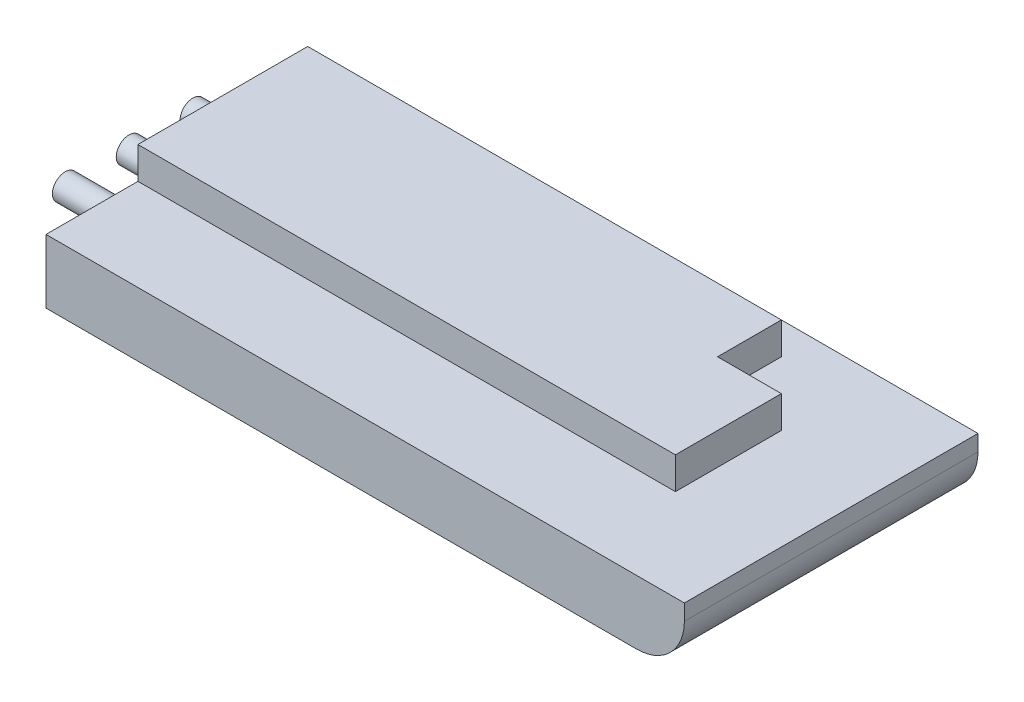
ISO-10303-21;
HEADER;
FILE_DESCRIPTION(('STEP AP214'),'2;1');
FILE_NAME('part.step','',(''),(''),'','','');
FILE_SCHEMA(('AUTOMOTIVE_DESIGN { 1 0 10303 214 1 1 1 1 }'));
ENDSEC;
DATA;
#1=APPLICATION_CONTEXT('core data for automotive mechanical design processes');
#2=APPLICATION_PROTOCOL_DEFINITION('international standard','automotive_design',2000,#1);
#3=PRODUCT_CONTEXT('',#1,'mechanical');
#4=PRODUCT('Part','Part','',(#3));
#5=PRODUCT_RELATED_PRODUCT_CATEGORY('part','',(#4));
#6=PRODUCT_DEFINITION_FORMATION('','',#4);
#7=PRODUCT_DEFINITION_CONTEXT('part definition',#1,'design');
#8=PRODUCT_DEFINITION('design','',#6,#7);
#9=PRODUCT_DEFINITION_SHAPE('','',#8);
#10=(LENGTH_UNIT() NAMED_UNIT(*) SI_UNIT(.MILLI.,.METRE.));
#11=(NAMED_UNIT(*) PLANE_ANGLE_UNIT() SI_UNIT($,.RADIAN.));
#12=(NAMED_UNIT(*) SI_UNIT($,.STERADIAN.) SOLID_ANGLE_UNIT());
#13=UNCERTAINTY_MEASURE_WITH_UNIT(LENGTH_MEASURE(1.E-05),#10,'distance_accuracy_value','');
#14=(GEOMETRIC_REPRESENTATION_CONTEXT(3) GLOBAL_UNCERTAINTY_ASSIGNED_CONTEXT((#13)) GLOBAL_UNIT_ASSIGNED_CONTEXT((#10,
#11,#12)) REPRESENTATION_CONTEXT('',''));
#15=CARTESIAN_POINT('',(0.,0.,0.));
#16=DIRECTION('',(0.,0.,1.));
#17=DIRECTION('',(1.,0.,0.));
#18=AXIS2_PLACEMENT_3D('',#15,#16,#17);
#19=CARTESIAN_POINT('',(0.,12.7,0.));
#20=DIRECTION('',(0.,1.,0.));
#21=DIRECTION('',(0.,0.,1.));
#22=AXIS2_PLACEMENT_3D('',#19,#20,#21);
#23=PLANE('',#22);
#24=DIRECTION('',(0.,0.,-1.));
#25=VECTOR('',#24,1.);
#26=CARTESIAN_POINT('',(221.234,12.7,0.));
#27=LINE('',#26,#25);
#28=CARTESIAN_POINT('',(221.234,12.7,-39.37));
#29=VERTEX_POINT('',#28);
#30=CARTESIAN_POINT('',(221.234,12.7,-52.07));
#31=VERTEX_POINT('',#30);
#32=EDGE_CURVE('E190',#29,#31,#27,.T.);
#33=ORIENTED_EDGE('',*,*,#32,.F.);
#34=DIRECTION('',(-1.,0.,0.));
#35=VECTOR('',#34,1.);
#36=CARTESIAN_POINT('',(233.934,12.7,-39.37));
#37=LINE('',#36,#35);
#38=CARTESIAN_POINT('',(233.934,12.7,-39.37));
#39=VERTEX_POINT('',#38);
#40=EDGE_CURVE('E146',#39,#29,#37,.T.);
#41=ORIENTED_EDGE('',*,*,#40,.F.);
#42=DIRECTION('',(0.,0.,-1.));
#43=VECTOR('',#42,1.);
#44=CARTESIAN_POINT('',(233.934,12.7,-18.288));
#45=LINE('',#44,#43);
#46=CARTESIAN_POINT('',(233.934,12.7,-18.288));
#47=VERTEX_POINT('',#46);
#48=EDGE_CURVE('E139',#47,#39,#45,.T.);
#49=ORIENTED_EDGE('',*,*,#48,.F.);
#50=DIRECTION('',(-1.,0.,0.));
#51=VECTOR('',#50,1.);
#52=CARTESIAN_POINT('',(0.,12.7,-18.288));
#53=LINE('',#52,#51);
#54=CARTESIAN_POINT('',(127.,12.7,-18.288));
#55=VERTEX_POINT('',#54);
#56=EDGE_CURVE('E123',#47,#55,#53,.T.);
#57=ORIENTED_EDGE('',*,*,#56,.T.);
#58=DIRECTION('',(0.,0.,1.));
#59=VECTOR('',#58,1.);
#60=CARTESIAN_POINT('',(127.,12.7,0.));
#61=LINE('',#60,#59);
#62=CARTESIAN_POINT('',(127.,12.7,0.));
#63=VERTEX_POINT('',#62);
#64=EDGE_CURVE('E182',#55,#63,#61,.T.);
#65=ORIENTED_EDGE('',*,*,#64,.T.);
#66=DIRECTION('',(1.,0.,0.));
#67=VECTOR('',#66,1.);
#68=CARTESIAN_POINT('',(0.,12.7,0.));
#69=LINE('',#68,#67);
#70=CARTESIAN_POINT('',(254.,12.7,0.));
#71=VERTEX_POINT('',#70);
#72=EDGE_CURVE('E192',#63,#71,#69,.T.);
#73=ORIENTED_EDGE('',*,*,#72,.T.);
#74=DIRECTION('',(0.,0.,-1.));
#75=VECTOR('',#74,1.);
#76=CARTESIAN_POINT('',(254.,12.7,0.));
#77=LINE('',#76,#75);
#78=CARTESIAN_POINT('',(254.,12.7,-58.42));
#79=VERTEX_POINT('',#78);
#80=EDGE_CURVE('E194',#71,#79,#77,.T.);
#81=ORIENTED_EDGE('',*,*,#80,.T.);
#82=DIRECTION('',(-1.,0.,0.));
#83=VECTOR('',#82,1.);
#84=CARTESIAN_POINT('',(0.,12.7,-58.42));
#85=LINE('',#84,#83);
#86=CARTESIAN_POINT('',(127.,12.7,-58.42));
#87=VERTEX_POINT('',#86);
#88=EDGE_CURVE('E196',#79,#87,#85,.T.);
#89=ORIENTED_EDGE('',*,*,#88,.T.);
#90=CARTESIAN_POINT('',(127.,12.7,-52.07));
#91=VERTEX_POINT('',#90);
#92=EDGE_CURVE('E184',#87,#91,#61,.T.);
#93=ORIENTED_EDGE('',*,*,#92,.T.);
#94=DIRECTION('',(-1.,0.,0.));
#95=VECTOR('',#94,1.);
#96=CARTESIAN_POINT('',(0.,12.7,-52.07));
#97=LINE('',#96,#95);
#98=EDGE_CURVE('E132',#31,#91,#97,.T.);
#99=ORIENTED_EDGE('',*,*,#98,.F.);
#100=EDGE_LOOP('',(#33,#41,#49,#57,#65,#73,#81,#89,#93,#99));
#101=FACE_BOUND('',#100,.T.);
#102=ADVANCED_FACE('F40',(#101),#23,.T.);
#103=CARTESIAN_POINT('',(221.234,12.7,0.));
#104=DIRECTION('',(1.,0.,0.));
#105=DIRECTION('',(0.,0.,-1.));
#106=AXIS2_PLACEMENT_3D('',#103,#104,#105);
#107=PLANE('',#106);
#108=DIRECTION('',(0.,0.,-1.));
#109=VECTOR('',#108,1.);
#110=CARTESIAN_POINT('',(221.234,19.05,0.));
#111=LINE('',#110,#109);
#112=CARTESIAN_POINT('',(221.234,19.05,-39.37));
#113=VERTEX_POINT('',#112);
#114=CARTESIAN_POINT('',(221.234,19.05,-52.07));
#115=VERTEX_POINT('',#114);
#116=EDGE_CURVE('E133',#113,#115,#111,.T.);
#117=ORIENTED_EDGE('',*,*,#116,.F.);
#118=DIRECTION('',(0.,-1.,0.));
#119=VECTOR('',#118,1.);
#120=CARTESIAN_POINT('',(221.234,43.6618005030107,-39.37));
#121=LINE('',#120,#119);
#122=EDGE_CURVE('E55',#113,#29,#121,.T.);
#123=ORIENTED_EDGE('',*,*,#122,.T.);
#124=ORIENTED_EDGE('',*,*,#32,.T.);
#125=DIRECTION('',(0.,1.,0.));
#126=VECTOR('',#125,1.);
#127=CARTESIAN_POINT('',(221.234,12.7,-52.07));
#128=LINE('',#127,#126);
#129=EDGE_CURVE('E199',#31,#115,#128,.T.);
#130=ORIENTED_EDGE('',*,*,#129,.T.);
#131=EDGE_LOOP('',(#117,#123,#124,#130));
#132=FACE_BOUND('',#131,.T.);
#133=ADVANCED_FACE('F254',(#132),#107,.T.);
#134=CARTESIAN_POINT('',(0.,19.05,0.));
#135=DIRECTION('',(0.,0.,-1.));
#136=DIRECTION('',(-1.,0.,0.));
#137=AXIS2_PLACEMENT_3D('',#134,#135,#136);
#138=PLANE('',#137);
#139=DIRECTION('',(0.,-1.,0.));
#140=VECTOR('',#139,1.);
#141=CARTESIAN_POINT('',(127.,0.,0.));
#142=LINE('',#141,#140);
#143=CARTESIAN_POINT('',(127.,0.,0.));
#144=VERTEX_POINT('',#143);
#145=EDGE_CURVE('E175',#63,#144,#142,.T.);
#146=ORIENTED_EDGE('',*,*,#145,.T.);
#147=DIRECTION('',(1.,0.,0.));
#148=VECTOR('',#147,1.);
#149=CARTESIAN_POINT('',(0.,0.,0.));
#150=LINE('',#149,#148);
#151=CARTESIAN_POINT('',(244.475,0.,0.));
#152=VERTEX_POINT('',#151);
#153=EDGE_CURVE('E207',#144,#152,#150,.T.);
#154=ORIENTED_EDGE('',*,*,#153,.T.);
#155=CARTESIAN_POINT('',(244.475,9.525,0.));
#156=DIRECTION('',(0.,0.,-1.));
#157=DIRECTION('',(-1.,0.,0.));
#158=AXIS2_PLACEMENT_3D('',#155,#156,#157);
#159=CIRCLE('',#158,9.525);
#160=CARTESIAN_POINT('',(254.,9.525,0.));
#161=VERTEX_POINT('',#160);
#162=EDGE_CURVE('E48',#152,#161,#159,.F.);
#163=ORIENTED_EDGE('',*,*,#162,.T.);
#164=DIRECTION('',(0.,-1.,0.));
#165=VECTOR('',#164,1.);
#166=CARTESIAN_POINT('',(254.,19.05,0.));
#167=LINE('',#166,#165);
#168=EDGE_CURVE('E215',#71,#161,#167,.T.);
#169=ORIENTED_EDGE('',*,*,#168,.F.);
#170=ORIENTED_EDGE('',*,*,#72,.F.);
#171=EDGE_LOOP('',(#146,#154,#163,#169,#170));
#172=FACE_BOUND('',#171,.T.);
#173=ADVANCED_FACE('F228',(#172),#138,.F.);
#174=CARTESIAN_POINT('',(0.,19.05,-58.42));
#175=DIRECTION('',(0.,0.,1.));
#176=DIRECTION('',(1.,0.,0.));
#177=AXIS2_PLACEMENT_3D('',#174,#175,#176);
#178=PLANE('',#177);
#179=DIRECTION('',(0.,-1.,0.));
#180=VECTOR('',#179,1.);
#181=CARTESIAN_POINT('',(127.,19.05,-58.42));
#182=LINE('',#181,#180);
#183=CARTESIAN_POINT('',(127.,0.,-58.42));
#184=VERTEX_POINT('',#183);
#185=EDGE_CURVE('E185',#87,#184,#182,.T.);
#186=ORIENTED_EDGE('',*,*,#185,.F.);
#187=ORIENTED_EDGE('',*,*,#88,.F.);
#188=DIRECTION('',(0.,-1.,0.));
#189=VECTOR('',#188,1.);
#190=CARTESIAN_POINT('',(254.,19.05,-58.42));
#191=LINE('',#190,#189);
#192=CARTESIAN_POINT('',(254.,9.525,-58.42));
#193=VERTEX_POINT('',#192);
#194=EDGE_CURVE('E212',#79,#193,#191,.T.);
#195=ORIENTED_EDGE('',*,*,#194,.T.);
#196=CARTESIAN_POINT('',(244.475,9.525,-58.42));
#197=DIRECTION('',(0.,0.,1.));
#198=DIRECTION('',(1.,0.,0.));
#199=AXIS2_PLACEMENT_3D('',#196,#197,#198);
#200=CIRCLE('',#199,9.525);
#201=CARTESIAN_POINT('',(244.475,0.,-58.42));
#202=VERTEX_POINT('',#201);
#203=EDGE_CURVE('E221',#193,#202,#200,.F.);
#204=ORIENTED_EDGE('',*,*,#203,.T.);
#205=DIRECTION('',(-1.,0.,0.));
#206=VECTOR('',#205,1.);
#207=CARTESIAN_POINT('',(0.,0.,-58.42));
#208=LINE('',#207,#206);
#209=EDGE_CURVE('E209',#202,#184,#208,.T.);
#210=ORIENTED_EDGE('',*,*,#209,.T.);
#211=EDGE_LOOP('',(#186,#187,#195,#204,#210));
#212=FACE_BOUND('',#211,.T.);
#213=ADVANCED_FACE('F241',(#212),#178,.F.);
#214=CARTESIAN_POINT('',(0.,0.,0.));
#215=DIRECTION('',(0.,-1.,0.));
#216=DIRECTION('',(0.,0.,-1.));
#217=AXIS2_PLACEMENT_3D('',#214,#215,#216);
#218=PLANE('',#217);
#219=ORIENTED_EDGE('',*,*,#153,.F.);
#220=DIRECTION('',(0.,0.,-1.));
#221=VECTOR('',#220,1.);
#222=CARTESIAN_POINT('',(127.,0.,0.));
#223=LINE('',#222,#221);
#224=EDGE_CURVE('E170',#144,#184,#223,.T.);
#225=ORIENTED_EDGE('',*,*,#224,.T.);
#226=ORIENTED_EDGE('',*,*,#209,.F.);
#227=DIRECTION('',(0.,0.,-1.));
#228=VECTOR('',#227,1.);
#229=CARTESIAN_POINT('',(244.475,0.,0.));
#230=LINE('',#229,#228);
#231=EDGE_CURVE('E223',#202,#152,#230,.F.);
#232=ORIENTED_EDGE('',*,*,#231,.T.);
#233=EDGE_LOOP('',(#219,#225,#226,#232));
#234=FACE_BOUND('',#233,.T.);
#235=ADVANCED_FACE('F244',(#234),#218,.T.);
#236=CARTESIAN_POINT('',(0.,12.7,-18.288));
#237=DIRECTION('',(0.,0.,-1.));
#238=DIRECTION('',(-1.,0.,0.));
#239=AXIS2_PLACEMENT_3D('',#236,#237,#238);
#240=PLANE('',#239);
#241=DIRECTION('',(0.,1.,0.));
#242=VECTOR('',#241,1.);
#243=CARTESIAN_POINT('',(127.,12.7,-18.288));
#244=LINE('',#243,#242);
#245=CARTESIAN_POINT('',(127.,19.05,-18.288));
#246=VERTEX_POINT('',#245);
#247=EDGE_CURVE('E62',#55,#246,#244,.T.);
#248=ORIENTED_EDGE('',*,*,#247,.F.);
#249=ORIENTED_EDGE('',*,*,#56,.F.);
#250=DIRECTION('',(0.,-1.,0.));
#251=VECTOR('',#250,1.);
#252=CARTESIAN_POINT('',(233.934,43.6618005030107,-18.288));
#253=LINE('',#252,#251);
#254=CARTESIAN_POINT('',(233.934,19.05,-18.288));
#255=VERTEX_POINT('',#254);
#256=EDGE_CURVE('E127',#255,#47,#253,.T.);
#257=ORIENTED_EDGE('',*,*,#256,.F.);
#258=DIRECTION('',(-1.,0.,0.));
#259=VECTOR('',#258,1.);
#260=CARTESIAN_POINT('',(0.,19.05,-18.288));
#261=LINE('',#260,#259);
#262=EDGE_CURVE('E186',#255,#246,#261,.T.);
#263=ORIENTED_EDGE('',*,*,#262,.T.);
#264=EDGE_LOOP('',(#248,#249,#257,#263));
#265=FACE_BOUND('',#264,.T.);
#266=ADVANCED_FACE('F125',(#265),#240,.F.);
#267=CARTESIAN_POINT('',(0.,12.7,-52.07));
#268=DIRECTION('',(0.,0.,-1.));
#269=DIRECTION('',(-1.,0.,0.));
#270=AXIS2_PLACEMENT_3D('',#267,#268,#269);
#271=PLANE('',#270);
#272=ORIENTED_EDGE('',*,*,#98,.T.);
#273=DIRECTION('',(0.,1.,0.));
#274=VECTOR('',#273,1.);
#275=CARTESIAN_POINT('',(127.,12.7,-52.07));
#276=LINE('',#275,#274);
#277=CARTESIAN_POINT('',(127.,19.05,-52.07));
#278=VERTEX_POINT('',#277);
#279=EDGE_CURVE('E178',#91,#278,#276,.T.);
#280=ORIENTED_EDGE('',*,*,#279,.T.);
#281=DIRECTION('',(-1.,0.,0.));
#282=VECTOR('',#281,1.);
#283=CARTESIAN_POINT('',(0.,19.05,-52.07));
#284=LINE('',#283,#282);
#285=EDGE_CURVE('E201',#115,#278,#284,.T.);
#286=ORIENTED_EDGE('',*,*,#285,.F.);
#287=ORIENTED_EDGE('',*,*,#129,.F.);
#288=EDGE_LOOP('',(#272,#280,#286,#287));
#289=FACE_BOUND('',#288,.T.);
#290=ADVANCED_FACE('F250',(#289),#271,.T.);
#291=CARTESIAN_POINT('',(0.,19.05,0.));
#292=DIRECTION('',(0.,-1.,0.));
#293=DIRECTION('',(0.,0.,-1.));
#294=AXIS2_PLACEMENT_3D('',#291,#292,#293);
#295=PLANE('',#294);
#296=DIRECTION('',(0.,0.,-1.));
#297=VECTOR('',#296,1.);
#298=CARTESIAN_POINT('',(127.,19.05,0.));
#299=LINE('',#298,#297);
#300=EDGE_CURVE('E11',#246,#278,#299,.T.);
#301=ORIENTED_EDGE('',*,*,#300,.F.);
#302=ORIENTED_EDGE('',*,*,#262,.F.);
#303=DIRECTION('',(0.,0.,1.));
#304=VECTOR('',#303,1.);
#305=CARTESIAN_POINT('',(233.934,19.05,-18.288));
#306=LINE('',#305,#304);
#307=CARTESIAN_POINT('',(233.934,19.05,-39.37));
#308=VERTEX_POINT('',#307);
#309=EDGE_CURVE('E141',#308,#255,#306,.T.);
#310=ORIENTED_EDGE('',*,*,#309,.F.);
#311=DIRECTION('',(1.,0.,0.));
#312=VECTOR('',#311,1.);
#313=CARTESIAN_POINT('',(233.934,19.05,-39.37));
#314=LINE('',#313,#312);
#315=EDGE_CURVE('E142',#113,#308,#314,.T.);
#316=ORIENTED_EDGE('',*,*,#315,.F.);
#317=ORIENTED_EDGE('',*,*,#116,.T.);
#318=ORIENTED_EDGE('',*,*,#285,.T.);
#319=EDGE_LOOP('',(#301,#302,#310,#316,#317,#318));
#320=FACE_BOUND('',#319,.T.);
#321=ADVANCED_FACE('F256',(#320),#295,.F.);
#322=CARTESIAN_POINT('',(254.,19.05,0.));
#323=DIRECTION('',(-1.,0.,0.));
#324=DIRECTION('',(0.,0.,1.));
#325=AXIS2_PLACEMENT_3D('',#322,#323,#324);
#326=PLANE('',#325);
#327=ORIENTED_EDGE('',*,*,#168,.T.);
#328=DIRECTION('',(0.,0.,-1.));
#329=VECTOR('',#328,1.);
#330=CARTESIAN_POINT('',(254.,9.525,-58.42));
#331=LINE('',#330,#329);
#332=EDGE_CURVE('E218',#161,#193,#331,.T.);
#333=ORIENTED_EDGE('',*,*,#332,.T.);
#334=ORIENTED_EDGE('',*,*,#194,.F.);
#335=ORIENTED_EDGE('',*,*,#80,.F.);
#336=EDGE_LOOP('',(#327,#333,#334,#335));
#337=FACE_BOUND('',#336,.T.);
#338=ADVANCED_FACE('F236',(#337),#326,.F.);
#339=CARTESIAN_POINT('',(244.475,9.525,0.));
#340=DIRECTION('',(0.,0.,1.));
#341=DIRECTION('',(1.,0.,0.));
#342=AXIS2_PLACEMENT_3D('',#339,#340,#341);
#343=CYLINDRICAL_SURFACE('',#342,9.525);
#344=ORIENTED_EDGE('',*,*,#162,.F.);
#345=ORIENTED_EDGE('',*,*,#231,.F.);
#346=ORIENTED_EDGE('',*,*,#203,.F.);
#347=ORIENTED_EDGE('',*,*,#332,.F.);
#348=EDGE_LOOP('',(#344,#345,#346,#347));
#349=FACE_BOUND('',#348,.T.);
#350=ADVANCED_FACE('F42',(#349),#343,.T.);
#351=CARTESIAN_POINT('',(127.,0.,0.));
#352=DIRECTION('',(-1.,0.,0.));
#353=DIRECTION('',(0.,0.,1.));
#354=AXIS2_PLACEMENT_3D('',#351,#352,#353);
#355=PLANE('',#354);
#356=CARTESIAN_POINT('',(127.,6.34999999999982,-41.91));
#357=DIRECTION('',(-1.,0.,0.));
#358=DIRECTION('',(0.,0.,1.));
#359=AXIS2_PLACEMENT_3D('',#356,#357,#358);
#360=CIRCLE('',#359,2.54);
#361=CARTESIAN_POINT('',(127.,6.34999999999982,-39.37));
#362=VERTEX_POINT('',#361);
#363=EDGE_CURVE('E158',#362,#362,#360,.T.);
#364=ORIENTED_EDGE('',*,*,#363,.F.);
#365=EDGE_LOOP('',(#364));
#366=FACE_BOUND('',#365,.T.);
#367=CARTESIAN_POINT('',(127.,6.34999999999991,-29.21));
#368=DIRECTION('',(-1.,0.,0.));
#369=DIRECTION('',(0.,0.,1.));
#370=AXIS2_PLACEMENT_3D('',#367,#368,#369);
#371=CIRCLE('',#370,2.54);
#372=CARTESIAN_POINT('',(127.,6.34999999999991,-26.67));
#373=VERTEX_POINT('',#372);
#374=EDGE_CURVE('E157',#373,#373,#371,.T.);
#375=ORIENTED_EDGE('',*,*,#374,.F.);
#376=EDGE_LOOP('',(#375));
#377=FACE_BOUND('',#376,.T.);
#378=CARTESIAN_POINT('',(127.,6.35,-16.51));
#379=DIRECTION('',(-1.,0.,0.));
#380=DIRECTION('',(0.,0.,1.));
#381=AXIS2_PLACEMENT_3D('',#378,#379,#380);
#382=CIRCLE('',#381,2.54);
#383=CARTESIAN_POINT('',(127.,6.35,-13.97));
#384=VERTEX_POINT('',#383);
#385=EDGE_CURVE('E164',#384,#384,#382,.T.);
#386=ORIENTED_EDGE('',*,*,#385,.F.);
#387=EDGE_LOOP('',(#386));
#388=FACE_BOUND('',#387,.T.);
#389=ORIENTED_EDGE('',*,*,#185,.T.);
#390=ORIENTED_EDGE('',*,*,#224,.F.);
#391=ORIENTED_EDGE('',*,*,#145,.F.);
#392=ORIENTED_EDGE('',*,*,#64,.F.);
#393=ORIENTED_EDGE('',*,*,#247,.T.);
#394=ORIENTED_EDGE('',*,*,#300,.T.);
#395=ORIENTED_EDGE('',*,*,#279,.F.);
#396=ORIENTED_EDGE('',*,*,#92,.F.);
#397=EDGE_LOOP('',(#389,#390,#391,#392,#393,#394,#395,#396));
#398=FACE_BOUND('',#397,.T.);
#399=ADVANCED_FACE('F245',(#366,#377,#388,#398),#355,.T.);
#400=CARTESIAN_POINT('',(114.3,6.35,-16.51));
#401=DIRECTION('',(1.,0.,0.));
#402=DIRECTION('',(0.,0.,-1.));
#403=AXIS2_PLACEMENT_3D('',#400,#401,#402);
#404=CYLINDRICAL_SURFACE('',#403,2.54);
#405=CARTESIAN_POINT('',(114.3,6.35,-16.51));
#406=DIRECTION('',(-1.,0.,0.));
#407=DIRECTION('',(0.,0.,1.));
#408=AXIS2_PLACEMENT_3D('',#405,#406,#407);
#409=CIRCLE('',#408,2.54);
#410=CARTESIAN_POINT('',(114.3,6.35,-13.97));
#411=VERTEX_POINT('',#410);
#412=EDGE_CURVE('E167',#411,#411,#409,.T.);
#413=ORIENTED_EDGE('',*,*,#412,.F.);
#414=EDGE_LOOP('',(#413));
#415=FACE_BOUND('',#414,.T.);
#416=ORIENTED_EDGE('',*,*,#385,.T.);
#417=EDGE_LOOP('',(#416));
#418=FACE_BOUND('',#417,.T.);
#419=ADVANCED_FACE('F329',(#415,#418),#404,.T.);
#420=CARTESIAN_POINT('',(114.3,6.35,-16.51));
#421=DIRECTION('',(-1.,0.,0.));
#422=DIRECTION('',(0.,0.,1.));
#423=AXIS2_PLACEMENT_3D('',#420,#421,#422);
#424=PLANE('',#423);
#425=ORIENTED_EDGE('',*,*,#412,.T.);
#426=EDGE_LOOP('',(#425));
#427=FACE_BOUND('',#426,.T.);
#428=ADVANCED_FACE('F336',(#427),#424,.T.);
#429=CARTESIAN_POINT('',(114.3,6.34999999999991,-29.21));
#430=DIRECTION('',(1.,0.,0.));
#431=DIRECTION('',(0.,0.,-1.));
#432=AXIS2_PLACEMENT_3D('',#429,#430,#431);
#433=CYLINDRICAL_SURFACE('',#432,2.54);
#434=CARTESIAN_POINT('',(114.3,6.34999999999991,-29.21));
#435=DIRECTION('',(-1.,0.,0.));
#436=DIRECTION('',(0.,0.,1.));
#437=AXIS2_PLACEMENT_3D('',#434,#435,#436);
#438=CIRCLE('',#437,2.54);
#439=CARTESIAN_POINT('',(114.3,6.34999999999991,-26.67));
#440=VERTEX_POINT('',#439);
#441=EDGE_CURVE('E161',#440,#440,#438,.T.);
#442=ORIENTED_EDGE('',*,*,#441,.F.);
#443=EDGE_LOOP('',(#442));
#444=FACE_BOUND('',#443,.T.);
#445=ORIENTED_EDGE('',*,*,#374,.T.);
#446=EDGE_LOOP('',(#445));
#447=FACE_BOUND('',#446,.T.);
#448=ADVANCED_FACE('F343',(#444,#447),#433,.T.);
#449=CARTESIAN_POINT('',(114.3,6.34999999999991,-29.21));
#450=DIRECTION('',(-1.,0.,0.));
#451=DIRECTION('',(0.,0.,1.));
#452=AXIS2_PLACEMENT_3D('',#449,#450,#451);
#453=PLANE('',#452);
#454=ORIENTED_EDGE('',*,*,#441,.T.);
#455=EDGE_LOOP('',(#454));
#456=FACE_BOUND('',#455,.T.);
#457=ADVANCED_FACE('F351',(#456),#453,.T.);
#458=CARTESIAN_POINT('',(114.3,6.34999999999982,-41.91));
#459=DIRECTION('',(1.,0.,0.));
#460=DIRECTION('',(0.,0.,-1.));
#461=AXIS2_PLACEMENT_3D('',#458,#459,#460);
#462=CYLINDRICAL_SURFACE('',#461,2.54);
#463=CARTESIAN_POINT('',(114.3,6.34999999999982,-41.91));
#464=DIRECTION('',(-1.,0.,0.));
#465=DIRECTION('',(0.,0.,1.));
#466=AXIS2_PLACEMENT_3D('',#463,#464,#465);
#467=CIRCLE('',#466,2.54);
#468=CARTESIAN_POINT('',(114.3,6.34999999999982,-39.37));
#469=VERTEX_POINT('',#468);
#470=EDGE_CURVE('E154',#469,#469,#467,.T.);
#471=ORIENTED_EDGE('',*,*,#470,.F.);
#472=EDGE_LOOP('',(#471));
#473=FACE_BOUND('',#472,.T.);
#474=ORIENTED_EDGE('',*,*,#363,.T.);
#475=EDGE_LOOP('',(#474));
#476=FACE_BOUND('',#475,.T.);
#477=ADVANCED_FACE('F266',(#473,#476),#462,.T.);
#478=CARTESIAN_POINT('',(114.3,6.34999999999982,-41.91));
#479=DIRECTION('',(-1.,0.,0.));
#480=DIRECTION('',(0.,0.,1.));
#481=AXIS2_PLACEMENT_3D('',#478,#479,#480);
#482=PLANE('',#481);
#483=ORIENTED_EDGE('',*,*,#470,.T.);
#484=EDGE_LOOP('',(#483));
#485=FACE_BOUND('',#484,.T.);
#486=ADVANCED_FACE('F259',(#485),#482,.T.);
#487=CARTESIAN_POINT('',(233.934,43.6618005030107,-39.37));
#488=DIRECTION('',(0.,0.,1.));
#489=DIRECTION('',(1.,0.,0.));
#490=AXIS2_PLACEMENT_3D('',#487,#488,#489);
#491=PLANE('',#490);
#492=ORIENTED_EDGE('',*,*,#122,.F.);
#493=ORIENTED_EDGE('',*,*,#315,.T.);
#494=DIRECTION('',(0.,-1.,0.));
#495=VECTOR('',#494,1.);
#496=CARTESIAN_POINT('',(233.934,43.6618005030107,-39.37));
#497=LINE('',#496,#495);
#498=EDGE_CURVE('E143',#308,#39,#497,.T.);
#499=ORIENTED_EDGE('',*,*,#498,.T.);
#500=ORIENTED_EDGE('',*,*,#40,.T.);
#501=EDGE_LOOP('',(#492,#493,#499,#500));
#502=FACE_BOUND('',#501,.T.);
#503=ADVANCED_FACE('F257',(#502),#491,.F.);
#504=CARTESIAN_POINT('',(233.934,43.6618005030107,-18.288));
#505=DIRECTION('',(-1.,0.,0.));
#506=DIRECTION('',(0.,0.,1.));
#507=AXIS2_PLACEMENT_3D('',#504,#505,#506);
#508=PLANE('',#507);
#509=ORIENTED_EDGE('',*,*,#498,.F.);
#510=ORIENTED_EDGE('',*,*,#309,.T.);
#511=ORIENTED_EDGE('',*,*,#256,.T.);
#512=ORIENTED_EDGE('',*,*,#48,.T.);
#513=EDGE_LOOP('',(#509,#510,#511,#512));
#514=FACE_BOUND('',#513,.T.);
#515=ADVANCED_FACE('F138',(#514),#508,.F.);
#516=CLOSED_SHELL('',(#102,#133,#173,#213,#235,#266,#290,#321,#338,#350,#399,#419,#428,#448,
#457,#477,#486,#503,#515));
#517=MANIFOLD_SOLID_BREP('B2',#516);
#518=ADVANCED_BREP_SHAPE_REPRESENTATION('',(#18,#517),#14);
#519=SHAPE_DEFINITION_REPRESENTATION(#9,#518);
ENDSEC;
END-ISO-10303-21;
